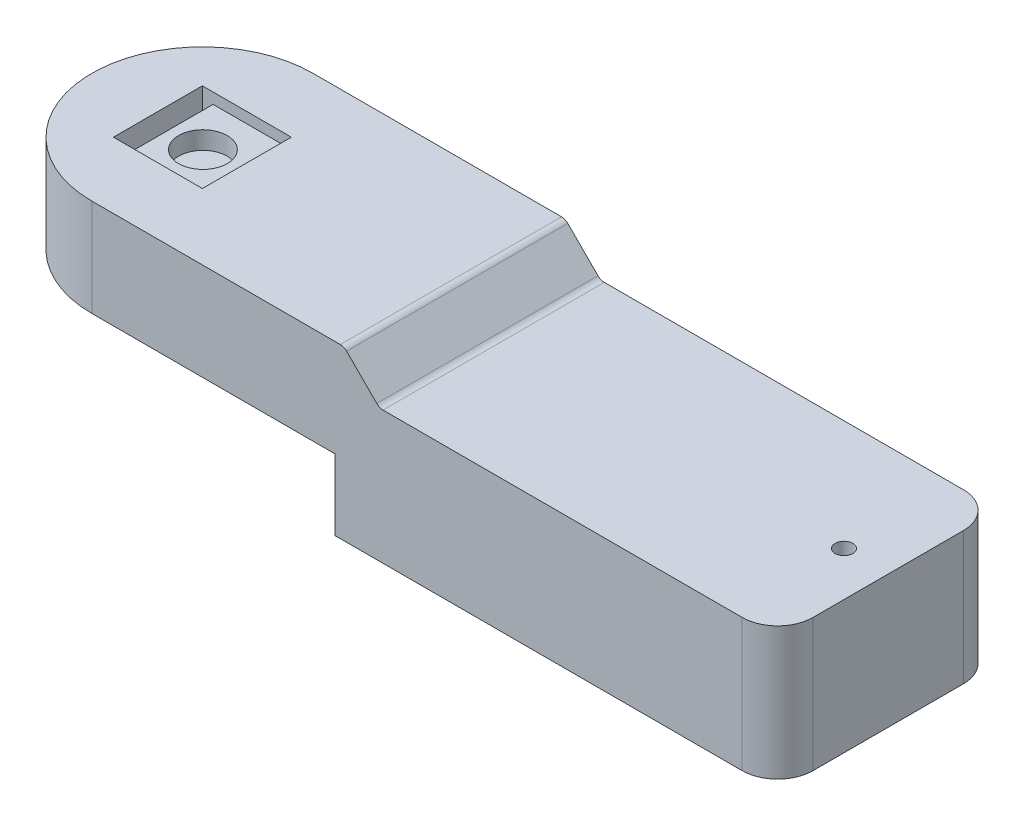
ISO-10303-21;
HEADER;
FILE_DESCRIPTION(('STEP AP214'),'2;1');
FILE_NAME('part.step','',(''),(''),'','','');
FILE_SCHEMA(('AUTOMOTIVE_DESIGN { 1 0 10303 214 1 1 1 1 }'));
ENDSEC;
DATA;
#1=APPLICATION_CONTEXT('core data for automotive mechanical design processes');
#2=APPLICATION_PROTOCOL_DEFINITION('international standard','automotive_design',2000,#1);
#3=PRODUCT_CONTEXT('',#1,'mechanical');
#4=PRODUCT('Part','Part','',(#3));
#5=PRODUCT_RELATED_PRODUCT_CATEGORY('part','',(#4));
#6=PRODUCT_DEFINITION_FORMATION('','',#4);
#7=PRODUCT_DEFINITION_CONTEXT('part definition',#1,'design');
#8=PRODUCT_DEFINITION('design','',#6,#7);
#9=PRODUCT_DEFINITION_SHAPE('','',#8);
#10=(LENGTH_UNIT() NAMED_UNIT(*) SI_UNIT(.MILLI.,.METRE.));
#11=(NAMED_UNIT(*) PLANE_ANGLE_UNIT() SI_UNIT($,.RADIAN.));
#12=(NAMED_UNIT(*) SI_UNIT($,.STERADIAN.) SOLID_ANGLE_UNIT());
#13=UNCERTAINTY_MEASURE_WITH_UNIT(LENGTH_MEASURE(1.E-05),#10,'distance_accuracy_value','');
#14=(GEOMETRIC_REPRESENTATION_CONTEXT(3) GLOBAL_UNCERTAINTY_ASSIGNED_CONTEXT((#13)) GLOBAL_UNIT_ASSIGNED_CONTEXT((#10,
#11,#12)) REPRESENTATION_CONTEXT('',''));
#15=CARTESIAN_POINT('',(0.,0.,0.));
#16=DIRECTION('',(0.,0.,1.));
#17=DIRECTION('',(1.,0.,0.));
#18=AXIS2_PLACEMENT_3D('',#15,#16,#17);
#19=CARTESIAN_POINT('',(-17.5,11.,0.));
#20=DIRECTION('',(0.,-1.,0.));
#21=DIRECTION('',(0.,0.,-1.));
#22=AXIS2_PLACEMENT_3D('',#19,#20,#21);
#23=CYLINDRICAL_SURFACE('',#22,12.5);
#24=DIRECTION('',(0.,-1.,0.));
#25=VECTOR('',#24,1.);
#26=CARTESIAN_POINT('',(-17.5,11.,12.5));
#27=LINE('',#26,#25);
#28=CARTESIAN_POINT('',(-17.5,11.,12.5));
#29=VERTEX_POINT('',#28);
#30=CARTESIAN_POINT('',(-17.5,0.,12.5));
#31=VERTEX_POINT('',#30);
#32=EDGE_CURVE('E298',#29,#31,#27,.T.);
#33=ORIENTED_EDGE('',*,*,#32,.F.);
#34=CARTESIAN_POINT('',(-17.5,11.,0.));
#35=DIRECTION('',(0.,1.,0.));
#36=DIRECTION('',(0.,0.,1.));
#37=AXIS2_PLACEMENT_3D('',#34,#35,#36);
#38=CIRCLE('',#37,12.5);
#39=CARTESIAN_POINT('',(-17.5,11.,-12.5));
#40=VERTEX_POINT('',#39);
#41=EDGE_CURVE('E304',#40,#29,#38,.T.);
#42=ORIENTED_EDGE('',*,*,#41,.F.);
#43=DIRECTION('',(0.,-1.,0.));
#44=VECTOR('',#43,1.);
#45=CARTESIAN_POINT('',(-17.5,11.,-12.5));
#46=LINE('',#45,#44);
#47=CARTESIAN_POINT('',(-17.5,0.,-12.5));
#48=VERTEX_POINT('',#47);
#49=EDGE_CURVE('E301',#48,#40,#46,.F.);
#50=ORIENTED_EDGE('',*,*,#49,.F.);
#51=CARTESIAN_POINT('',(-17.5,0.,0.));
#52=DIRECTION('',(0.,1.,0.));
#53=DIRECTION('',(0.,0.,1.));
#54=AXIS2_PLACEMENT_3D('',#51,#52,#53);
#55=CIRCLE('',#54,12.5);
#56=EDGE_CURVE('E306',#31,#48,#55,.F.);
#57=ORIENTED_EDGE('',*,*,#56,.F.);
#58=EDGE_LOOP('',(#33,#42,#50,#57));
#59=FACE_BOUND('',#58,.T.);
#60=ADVANCED_FACE('F39',(#59),#23,.T.);
#61=CARTESIAN_POINT('',(60.,11.,-12.5));
#62=DIRECTION('',(-1.,0.,0.));
#63=DIRECTION('',(0.,0.,1.));
#64=AXIS2_PLACEMENT_3D('',#61,#62,#63);
#65=PLANE('',#64);
#66=DIRECTION('',(0.,0.,1.));
#67=VECTOR('',#66,1.);
#68=CARTESIAN_POINT('',(60.,-8.,12.5));
#69=LINE('',#68,#67);
#70=CARTESIAN_POINT('',(60.,-8.,-8.5));
#71=VERTEX_POINT('',#70);
#72=CARTESIAN_POINT('',(60.,-8.,8.5));
#73=VERTEX_POINT('',#72);
#74=EDGE_CURVE('E269',#71,#73,#69,.T.);
#75=ORIENTED_EDGE('',*,*,#74,.F.);
#76=DIRECTION('',(0.,-1.,0.));
#77=VECTOR('',#76,1.);
#78=CARTESIAN_POINT('',(60.,11.,-8.5));
#79=LINE('',#78,#77);
#80=CARTESIAN_POINT('',(60.,7.,-8.5));
#81=VERTEX_POINT('',#80);
#82=EDGE_CURVE('E60',#71,#81,#79,.F.);
#83=ORIENTED_EDGE('',*,*,#82,.T.);
#84=DIRECTION('',(0.,0.,-1.));
#85=VECTOR('',#84,1.);
#86=CARTESIAN_POINT('',(60.,7.,12.5));
#87=LINE('',#86,#85);
#88=CARTESIAN_POINT('',(60.,7.,8.5));
#89=VERTEX_POINT('',#88);
#90=EDGE_CURVE('E258',#89,#81,#87,.T.);
#91=ORIENTED_EDGE('',*,*,#90,.F.);
#92=DIRECTION('',(0.,-1.,0.));
#93=VECTOR('',#92,1.);
#94=CARTESIAN_POINT('',(60.,11.,8.5));
#95=LINE('',#94,#93);
#96=EDGE_CURVE('E334',#89,#73,#95,.T.);
#97=ORIENTED_EDGE('',*,*,#96,.T.);
#98=EDGE_LOOP('',(#75,#83,#91,#97));
#99=FACE_BOUND('',#98,.T.);
#100=ADVANCED_FACE('F352',(#99),#65,.F.);
#101=CARTESIAN_POINT('',(0.,0.,0.));
#102=DIRECTION('',(0.,1.,0.));
#103=DIRECTION('',(0.,0.,1.));
#104=AXIS2_PLACEMENT_3D('',#101,#102,#103);
#105=PLANE('',#104);
#106=CARTESIAN_POINT('',(-17.5,0.,0.));
#107=DIRECTION('',(0.,-1.,0.));
#108=DIRECTION('',(0.,0.,-1.));
#109=AXIS2_PLACEMENT_3D('',#106,#107,#108);
#110=CIRCLE('',#109,6.96);
#111=CARTESIAN_POINT('',(-17.5,0.,-6.96));
#112=VERTEX_POINT('',#111);
#113=EDGE_CURVE('E495',#112,#112,#110,.T.);
#114=ORIENTED_EDGE('',*,*,#113,.F.);
#115=EDGE_LOOP('',(#114));
#116=FACE_BOUND('',#115,.T.);
#117=DIRECTION('',(1.,0.,0.));
#118=VECTOR('',#117,1.);
#119=CARTESIAN_POINT('',(-30.,0.,12.5));
#120=LINE('',#119,#118);
#121=CARTESIAN_POINT('',(9.99999999999998,0.,12.5));
#122=VERTEX_POINT('',#121);
#123=EDGE_CURVE('E282',#31,#122,#120,.T.);
#124=ORIENTED_EDGE('',*,*,#123,.F.);
#125=ORIENTED_EDGE('',*,*,#56,.T.);
#126=DIRECTION('',(-1.,0.,0.));
#127=VECTOR('',#126,1.);
#128=CARTESIAN_POINT('',(-30.,0.,-12.5));
#129=LINE('',#128,#127);
#130=CARTESIAN_POINT('',(9.99999999999999,0.,-12.5));
#131=VERTEX_POINT('',#130);
#132=EDGE_CURVE('E287',#131,#48,#129,.T.);
#133=ORIENTED_EDGE('',*,*,#132,.F.);
#134=DIRECTION('',(0.,0.,-1.));
#135=VECTOR('',#134,1.);
#136=CARTESIAN_POINT('',(9.99999999999999,0.,-12.5));
#137=LINE('',#136,#135);
#138=EDGE_CURVE('E262',#122,#131,#137,.T.);
#139=ORIENTED_EDGE('',*,*,#138,.F.);
#140=EDGE_LOOP('',(#124,#125,#133,#139));
#141=FACE_BOUND('',#140,.T.);
#142=ADVANCED_FACE('F367',(#116,#141),#105,.F.);
#143=CARTESIAN_POINT('',(-30.,11.,12.5));
#144=DIRECTION('',(0.,0.,-1.));
#145=DIRECTION('',(-1.,0.,0.));
#146=AXIS2_PLACEMENT_3D('',#143,#144,#145);
#147=PLANE('',#146);
#148=DIRECTION('',(-1.,0.,0.));
#149=VECTOR('',#148,1.);
#150=CARTESIAN_POINT('',(9.99999999999999,-8.,12.5));
#151=LINE('',#150,#149);
#152=CARTESIAN_POINT('',(56.,-8.,12.5));
#153=VERTEX_POINT('',#152);
#154=CARTESIAN_POINT('',(9.99999999999999,-8.,12.5));
#155=VERTEX_POINT('',#154);
#156=EDGE_CURVE('E272',#153,#155,#151,.T.);
#157=ORIENTED_EDGE('',*,*,#156,.F.);
#158=DIRECTION('',(0.,-1.,0.));
#159=VECTOR('',#158,1.);
#160=CARTESIAN_POINT('',(56.,11.,12.5));
#161=LINE('',#160,#159);
#162=CARTESIAN_POINT('',(56.,7.,12.5));
#163=VERTEX_POINT('',#162);
#164=EDGE_CURVE('E11',#153,#163,#161,.F.);
#165=ORIENTED_EDGE('',*,*,#164,.T.);
#166=DIRECTION('',(1.,0.,0.));
#167=VECTOR('',#166,1.);
#168=CARTESIAN_POINT('',(15.,7.,12.5));
#169=LINE('',#168,#167);
#170=CARTESIAN_POINT('',(15.4142135623731,7.,12.5));
#171=VERTEX_POINT('',#170);
#172=EDGE_CURVE('E250',#171,#163,#169,.T.);
#173=ORIENTED_EDGE('',*,*,#172,.F.);
#174=CARTESIAN_POINT('',(15.4142135623731,8.,12.5));
#175=DIRECTION('',(0.,0.,-1.));
#176=DIRECTION('',(-1.,0.,0.));
#177=AXIS2_PLACEMENT_3D('',#174,#175,#176);
#178=CIRCLE('',#177,1.);
#179=CARTESIAN_POINT('',(14.7071067811865,7.29289321881345,12.5));
#180=VERTEX_POINT('',#179);
#181=EDGE_CURVE('E322',#171,#180,#178,.T.);
#182=ORIENTED_EDGE('',*,*,#181,.T.);
#183=DIRECTION('',(-0.707106781186548,0.707106781186547,0.));
#184=VECTOR('',#183,1.);
#185=CARTESIAN_POINT('',(15.,6.99999999999998,12.5));
#186=LINE('',#185,#184);
#187=CARTESIAN_POINT('',(11.2928932188134,10.7071067811865,12.5));
#188=VERTEX_POINT('',#187);
#189=EDGE_CURVE('E289',#180,#188,#186,.T.);
#190=ORIENTED_EDGE('',*,*,#189,.T.);
#191=CARTESIAN_POINT('',(10.5857864376269,10.,12.5));
#192=DIRECTION('',(0.,0.,-1.));
#193=DIRECTION('',(-1.,0.,0.));
#194=AXIS2_PLACEMENT_3D('',#191,#192,#193);
#195=CIRCLE('',#194,1.);
#196=CARTESIAN_POINT('',(10.5857864376269,11.,12.5));
#197=VERTEX_POINT('',#196);
#198=EDGE_CURVE('E320',#188,#197,#195,.F.);
#199=ORIENTED_EDGE('',*,*,#198,.T.);
#200=DIRECTION('',(1.,0.,0.));
#201=VECTOR('',#200,1.);
#202=CARTESIAN_POINT('',(-30.,11.,12.5));
#203=LINE('',#202,#201);
#204=EDGE_CURVE('E283',#29,#197,#203,.T.);
#205=ORIENTED_EDGE('',*,*,#204,.F.);
#206=ORIENTED_EDGE('',*,*,#32,.T.);
#207=ORIENTED_EDGE('',*,*,#123,.T.);
#208=DIRECTION('',(0.,1.,0.));
#209=VECTOR('',#208,1.);
#210=CARTESIAN_POINT('',(9.99999999999999,-8.,12.5));
#211=LINE('',#210,#209);
#212=EDGE_CURVE('E274',#155,#122,#211,.T.);
#213=ORIENTED_EDGE('',*,*,#212,.F.);
#214=EDGE_LOOP('',(#157,#165,#173,#182,#190,#199,#205,#206,#207,#213));
#215=FACE_BOUND('',#214,.T.);
#216=ADVANCED_FACE('F357',(#215),#147,.F.);
#217=CARTESIAN_POINT('',(-30.,11.,-12.5));
#218=DIRECTION('',(0.,0.,1.));
#219=DIRECTION('',(1.,0.,0.));
#220=AXIS2_PLACEMENT_3D('',#217,#218,#219);
#221=PLANE('',#220);
#222=DIRECTION('',(-1.,0.,0.));
#223=VECTOR('',#222,1.);
#224=CARTESIAN_POINT('',(60.,7.,-12.5));
#225=LINE('',#224,#223);
#226=CARTESIAN_POINT('',(56.,7.,-12.5));
#227=VERTEX_POINT('',#226);
#228=CARTESIAN_POINT('',(15.4142135623731,7.,-12.5));
#229=VERTEX_POINT('',#228);
#230=EDGE_CURVE('E260',#227,#229,#225,.T.);
#231=ORIENTED_EDGE('',*,*,#230,.F.);
#232=DIRECTION('',(0.,-1.,0.));
#233=VECTOR('',#232,1.);
#234=CARTESIAN_POINT('',(56.,11.,-12.5));
#235=LINE('',#234,#233);
#236=CARTESIAN_POINT('',(56.,-8.,-12.5));
#237=VERTEX_POINT('',#236);
#238=EDGE_CURVE('E327',#227,#237,#235,.T.);
#239=ORIENTED_EDGE('',*,*,#238,.T.);
#240=DIRECTION('',(1.,0.,0.));
#241=VECTOR('',#240,1.);
#242=CARTESIAN_POINT('',(60.,-8.,-12.5));
#243=LINE('',#242,#241);
#244=CARTESIAN_POINT('',(9.99999999999999,-8.,-12.5));
#245=VERTEX_POINT('',#244);
#246=EDGE_CURVE('E266',#245,#237,#243,.T.);
#247=ORIENTED_EDGE('',*,*,#246,.F.);
#248=DIRECTION('',(0.,1.,0.));
#249=VECTOR('',#248,1.);
#250=CARTESIAN_POINT('',(9.99999999999999,-8.,-12.5));
#251=LINE('',#250,#249);
#252=EDGE_CURVE('E279',#245,#131,#251,.T.);
#253=ORIENTED_EDGE('',*,*,#252,.T.);
#254=ORIENTED_EDGE('',*,*,#132,.T.);
#255=ORIENTED_EDGE('',*,*,#49,.T.);
#256=DIRECTION('',(-1.,0.,0.));
#257=VECTOR('',#256,1.);
#258=CARTESIAN_POINT('',(-30.,11.,-12.5));
#259=LINE('',#258,#257);
#260=CARTESIAN_POINT('',(10.5857864376269,11.,-12.5));
#261=VERTEX_POINT('',#260);
#262=EDGE_CURVE('E286',#261,#40,#259,.T.);
#263=ORIENTED_EDGE('',*,*,#262,.F.);
#264=CARTESIAN_POINT('',(10.5857864376269,10.,-12.5));
#265=DIRECTION('',(0.,0.,1.));
#266=DIRECTION('',(1.,0.,0.));
#267=AXIS2_PLACEMENT_3D('',#264,#265,#266);
#268=CIRCLE('',#267,1.);
#269=CARTESIAN_POINT('',(11.2928932188134,10.7071067811865,-12.5));
#270=VERTEX_POINT('',#269);
#271=EDGE_CURVE('E318',#261,#270,#268,.F.);
#272=ORIENTED_EDGE('',*,*,#271,.T.);
#273=DIRECTION('',(0.707106781186548,-0.707106781186547,0.));
#274=VECTOR('',#273,1.);
#275=CARTESIAN_POINT('',(15.,6.99999999999998,-12.5));
#276=LINE('',#275,#274);
#277=CARTESIAN_POINT('',(14.7071067811865,7.29289321881345,-12.5));
#278=VERTEX_POINT('',#277);
#279=EDGE_CURVE('E295',#270,#278,#276,.T.);
#280=ORIENTED_EDGE('',*,*,#279,.T.);
#281=CARTESIAN_POINT('',(15.4142135623731,8.,-12.5));
#282=DIRECTION('',(0.,0.,1.));
#283=DIRECTION('',(1.,0.,0.));
#284=AXIS2_PLACEMENT_3D('',#281,#282,#283);
#285=CIRCLE('',#284,1.);
#286=EDGE_CURVE('E324',#278,#229,#285,.T.);
#287=ORIENTED_EDGE('',*,*,#286,.T.);
#288=EDGE_LOOP('',(#231,#239,#247,#253,#254,#255,#263,#272,#280,#287));
#289=FACE_BOUND('',#288,.T.);
#290=ADVANCED_FACE('F346',(#289),#221,.F.);
#291=CARTESIAN_POINT('',(0.,11.,0.));
#292=DIRECTION('',(0.,1.,0.));
#293=DIRECTION('',(0.,0.,1.));
#294=AXIS2_PLACEMENT_3D('',#291,#292,#293);
#295=PLANE('',#294);
#296=DIRECTION('',(0.,0.,1.));
#297=VECTOR('',#296,1.);
#298=CARTESIAN_POINT('',(-22.525,11.,-5.025));
#299=LINE('',#298,#297);
#300=CARTESIAN_POINT('',(-22.525,11.,-5.025));
#301=VERTEX_POINT('',#300);
#302=CARTESIAN_POINT('',(-22.525,11.,5.025));
#303=VERTEX_POINT('',#302);
#304=EDGE_CURVE('E213',#301,#303,#299,.T.);
#305=ORIENTED_EDGE('',*,*,#304,.F.);
#306=DIRECTION('',(-1.,0.,0.));
#307=VECTOR('',#306,1.);
#308=CARTESIAN_POINT('',(-22.525,11.,-5.025));
#309=LINE('',#308,#307);
#310=CARTESIAN_POINT('',(-12.475,11.,-5.025));
#311=VERTEX_POINT('',#310);
#312=EDGE_CURVE('E237',#311,#301,#309,.T.);
#313=ORIENTED_EDGE('',*,*,#312,.F.);
#314=DIRECTION('',(0.,0.,-1.));
#315=VECTOR('',#314,1.);
#316=CARTESIAN_POINT('',(-12.475,11.,-5.025));
#317=LINE('',#316,#315);
#318=CARTESIAN_POINT('',(-12.475,11.,5.025));
#319=VERTEX_POINT('',#318);
#320=EDGE_CURVE('E244',#319,#311,#317,.T.);
#321=ORIENTED_EDGE('',*,*,#320,.F.);
#322=DIRECTION('',(1.,0.,0.));
#323=VECTOR('',#322,1.);
#324=CARTESIAN_POINT('',(-22.525,11.,5.025));
#325=LINE('',#324,#323);
#326=EDGE_CURVE('E241',#303,#319,#325,.T.);
#327=ORIENTED_EDGE('',*,*,#326,.F.);
#328=EDGE_LOOP('',(#305,#313,#321,#327));
#329=FACE_BOUND('',#328,.T.);
#330=ORIENTED_EDGE('',*,*,#204,.T.);
#331=DIRECTION('',(0.,0.,-1.));
#332=VECTOR('',#331,1.);
#333=CARTESIAN_POINT('',(10.5857864376269,11.,0.));
#334=LINE('',#333,#332);
#335=EDGE_CURVE('E315',#197,#261,#334,.T.);
#336=ORIENTED_EDGE('',*,*,#335,.T.);
#337=ORIENTED_EDGE('',*,*,#262,.T.);
#338=ORIENTED_EDGE('',*,*,#41,.T.);
#339=EDGE_LOOP('',(#330,#336,#337,#338));
#340=FACE_BOUND('',#339,.T.);
#341=ADVANCED_FACE('F373',(#329,#340),#295,.T.);
#342=CARTESIAN_POINT('',(9.99999999999999,-8.,-12.5));
#343=DIRECTION('',(1.,0.,0.));
#344=DIRECTION('',(0.,0.,-1.));
#345=AXIS2_PLACEMENT_3D('',#342,#343,#344);
#346=PLANE('',#345);
#347=ORIENTED_EDGE('',*,*,#138,.T.);
#348=ORIENTED_EDGE('',*,*,#252,.F.);
#349=DIRECTION('',(0.,0.,-1.));
#350=VECTOR('',#349,1.);
#351=CARTESIAN_POINT('',(9.99999999999999,-8.,-12.5));
#352=LINE('',#351,#350);
#353=EDGE_CURVE('E263',#155,#245,#352,.T.);
#354=ORIENTED_EDGE('',*,*,#353,.F.);
#355=ORIENTED_EDGE('',*,*,#212,.T.);
#356=EDGE_LOOP('',(#347,#348,#354,#355));
#357=FACE_BOUND('',#356,.T.);
#358=ADVANCED_FACE('F363',(#357),#346,.F.);
#359=CARTESIAN_POINT('',(0.,-8.,0.));
#360=DIRECTION('',(0.,1.,0.));
#361=DIRECTION('',(0.,0.,1.));
#362=AXIS2_PLACEMENT_3D('',#359,#360,#361);
#363=PLANE('',#362);
#364=CARTESIAN_POINT('',(55.,-8.,0.));
#365=DIRECTION('',(0.,1.,0.));
#366=DIRECTION('',(0.,0.,1.));
#367=AXIS2_PLACEMENT_3D('',#364,#365,#366);
#368=CIRCLE('',#367,0.999999999999998);
#369=CARTESIAN_POINT('',(55.,-8.,0.999999999999998));
#370=VERTEX_POINT('',#369);
#371=EDGE_CURVE('E484',#370,#370,#368,.T.);
#372=ORIENTED_EDGE('',*,*,#371,.T.);
#373=EDGE_LOOP('',(#372));
#374=FACE_BOUND('',#373,.T.);
#375=ORIENTED_EDGE('',*,*,#246,.T.);
#376=CARTESIAN_POINT('',(56.,-8.,-8.5));
#377=DIRECTION('',(0.,1.,0.));
#378=DIRECTION('',(0.,0.,1.));
#379=AXIS2_PLACEMENT_3D('',#376,#377,#378);
#380=CIRCLE('',#379,4.);
#381=EDGE_CURVE('E332',#237,#71,#380,.F.);
#382=ORIENTED_EDGE('',*,*,#381,.T.);
#383=ORIENTED_EDGE('',*,*,#74,.T.);
#384=CARTESIAN_POINT('',(56.,-8.,8.5));
#385=DIRECTION('',(0.,1.,0.));
#386=DIRECTION('',(0.,0.,1.));
#387=AXIS2_PLACEMENT_3D('',#384,#385,#386);
#388=CIRCLE('',#387,4.);
#389=EDGE_CURVE('E330',#73,#153,#388,.F.);
#390=ORIENTED_EDGE('',*,*,#389,.T.);
#391=ORIENTED_EDGE('',*,*,#156,.T.);
#392=ORIENTED_EDGE('',*,*,#353,.T.);
#393=EDGE_LOOP('',(#375,#382,#383,#390,#391,#392));
#394=FACE_BOUND('',#393,.T.);
#395=ADVANCED_FACE('F351',(#374,#394),#363,.F.);
#396=CARTESIAN_POINT('',(0.,7.,0.));
#397=DIRECTION('',(0.,1.,0.));
#398=DIRECTION('',(0.,0.,1.));
#399=AXIS2_PLACEMENT_3D('',#396,#397,#398);
#400=PLANE('',#399);
#401=CARTESIAN_POINT('',(55.,7.,0.));
#402=DIRECTION('',(0.,1.,0.));
#403=DIRECTION('',(0.,0.,1.));
#404=AXIS2_PLACEMENT_3D('',#401,#402,#403);
#405=CIRCLE('',#404,0.999999999999998);
#406=CARTESIAN_POINT('',(55.,7.,0.999999999999998));
#407=VERTEX_POINT('',#406);
#408=EDGE_CURVE('E487',#407,#407,#405,.T.);
#409=ORIENTED_EDGE('',*,*,#408,.F.);
#410=EDGE_LOOP('',(#409));
#411=FACE_BOUND('',#410,.T.);
#412=ORIENTED_EDGE('',*,*,#90,.T.);
#413=CARTESIAN_POINT('',(56.,7.,-8.5));
#414=DIRECTION('',(0.,1.,0.));
#415=DIRECTION('',(0.,0.,1.));
#416=AXIS2_PLACEMENT_3D('',#413,#414,#415);
#417=CIRCLE('',#416,4.);
#418=EDGE_CURVE('E47',#81,#227,#417,.T.);
#419=ORIENTED_EDGE('',*,*,#418,.T.);
#420=ORIENTED_EDGE('',*,*,#230,.T.);
#421=DIRECTION('',(0.,0.,1.));
#422=VECTOR('',#421,1.);
#423=CARTESIAN_POINT('',(15.4142135623731,7.,12.5));
#424=LINE('',#423,#422);
#425=EDGE_CURVE('E308',#229,#171,#424,.T.);
#426=ORIENTED_EDGE('',*,*,#425,.T.);
#427=ORIENTED_EDGE('',*,*,#172,.T.);
#428=CARTESIAN_POINT('',(56.,7.,8.5));
#429=DIRECTION('',(0.,1.,0.));
#430=DIRECTION('',(0.,0.,1.));
#431=AXIS2_PLACEMENT_3D('',#428,#429,#430);
#432=CIRCLE('',#431,4.);
#433=EDGE_CURVE('E338',#163,#89,#432,.T.);
#434=ORIENTED_EDGE('',*,*,#433,.T.);
#435=EDGE_LOOP('',(#412,#419,#420,#426,#427,#434));
#436=FACE_BOUND('',#435,.T.);
#437=ADVANCED_FACE('F342',(#411,#436),#400,.T.);
#438=CARTESIAN_POINT('',(-22.525,9.79,-5.025));
#439=DIRECTION('',(-1.,0.,0.));
#440=DIRECTION('',(0.,0.,1.));
#441=AXIS2_PLACEMENT_3D('',#438,#439,#440);
#442=PLANE('',#441);
#443=ORIENTED_EDGE('',*,*,#304,.T.);
#444=DIRECTION('',(0.,1.,0.));
#445=VECTOR('',#444,1.);
#446=CARTESIAN_POINT('',(-22.525,9.79,5.025));
#447=LINE('',#446,#445);
#448=CARTESIAN_POINT('',(-22.525,7.77,5.025));
#449=VERTEX_POINT('',#448);
#450=EDGE_CURVE('E239',#449,#303,#447,.T.);
#451=ORIENTED_EDGE('',*,*,#450,.F.);
#452=DIRECTION('',(0.,0.,1.));
#453=VECTOR('',#452,1.);
#454=CARTESIAN_POINT('',(-22.525,7.77,5.025));
#455=LINE('',#454,#453);
#456=CARTESIAN_POINT('',(-22.525,7.77,-5.025));
#457=VERTEX_POINT('',#456);
#458=EDGE_CURVE('E215',#457,#449,#455,.T.);
#459=ORIENTED_EDGE('',*,*,#458,.F.);
#460=DIRECTION('',(0.,1.,0.));
#461=VECTOR('',#460,1.);
#462=CARTESIAN_POINT('',(-22.525,9.79,-5.025));
#463=LINE('',#462,#461);
#464=EDGE_CURVE('E248',#457,#301,#463,.T.);
#465=ORIENTED_EDGE('',*,*,#464,.T.);
#466=EDGE_LOOP('',(#443,#451,#459,#465));
#467=FACE_BOUND('',#466,.T.);
#468=ADVANCED_FACE('F422',(#467),#442,.F.);
#469=CARTESIAN_POINT('',(-22.525,9.79,-5.025));
#470=DIRECTION('',(0.,0.,-1.));
#471=DIRECTION('',(-1.,0.,0.));
#472=AXIS2_PLACEMENT_3D('',#469,#470,#471);
#473=PLANE('',#472);
#474=ORIENTED_EDGE('',*,*,#312,.T.);
#475=ORIENTED_EDGE('',*,*,#464,.F.);
#476=DIRECTION('',(-1.,0.,0.));
#477=VECTOR('',#476,1.);
#478=CARTESIAN_POINT('',(-22.525,7.77,-5.025));
#479=LINE('',#478,#477);
#480=CARTESIAN_POINT('',(-21.315,7.77,-5.025));
#481=VERTEX_POINT('',#480);
#482=EDGE_CURVE('E225',#481,#457,#479,.T.);
#483=ORIENTED_EDGE('',*,*,#482,.F.);
#484=DIRECTION('',(0.,1.,0.));
#485=VECTOR('',#484,1.);
#486=CARTESIAN_POINT('',(-21.315,7.77,-5.025));
#487=LINE('',#486,#485);
#488=CARTESIAN_POINT('',(-21.315,9.79,-5.025));
#489=VERTEX_POINT('',#488);
#490=EDGE_CURVE('E205',#481,#489,#487,.T.);
#491=ORIENTED_EDGE('',*,*,#490,.T.);
#492=DIRECTION('',(-1.,0.,0.));
#493=VECTOR('',#492,1.);
#494=CARTESIAN_POINT('',(-22.525,9.79,-5.025));
#495=LINE('',#494,#493);
#496=CARTESIAN_POINT('',(-13.685,9.79,-5.025));
#497=VERTEX_POINT('',#496);
#498=EDGE_CURVE('E186',#497,#489,#495,.T.);
#499=ORIENTED_EDGE('',*,*,#498,.F.);
#500=DIRECTION('',(0.,1.,0.));
#501=VECTOR('',#500,1.);
#502=CARTESIAN_POINT('',(-13.685,7.77,-5.025));
#503=LINE('',#502,#501);
#504=CARTESIAN_POINT('',(-13.685,7.77,-5.025));
#505=VERTEX_POINT('',#504);
#506=EDGE_CURVE('E178',#505,#497,#503,.T.);
#507=ORIENTED_EDGE('',*,*,#506,.F.);
#508=DIRECTION('',(-1.,0.,0.));
#509=VECTOR('',#508,1.);
#510=CARTESIAN_POINT('',(-12.475,7.77,-5.025));
#511=LINE('',#510,#509);
#512=CARTESIAN_POINT('',(-12.475,7.77,-5.025));
#513=VERTEX_POINT('',#512);
#514=EDGE_CURVE('E183',#513,#505,#511,.T.);
#515=ORIENTED_EDGE('',*,*,#514,.F.);
#516=DIRECTION('',(0.,1.,0.));
#517=VECTOR('',#516,1.);
#518=CARTESIAN_POINT('',(-12.475,9.79,-5.025));
#519=LINE('',#518,#517);
#520=EDGE_CURVE('E251',#513,#311,#519,.T.);
#521=ORIENTED_EDGE('',*,*,#520,.T.);
#522=EDGE_LOOP('',(#474,#475,#483,#491,#499,#507,#515,#521));
#523=FACE_BOUND('',#522,.T.);
#524=ADVANCED_FACE('F181',(#523),#473,.F.);
#525=CARTESIAN_POINT('',(-12.475,9.79,-5.025));
#526=DIRECTION('',(1.,0.,0.));
#527=DIRECTION('',(0.,0.,-1.));
#528=AXIS2_PLACEMENT_3D('',#525,#526,#527);
#529=PLANE('',#528);
#530=ORIENTED_EDGE('',*,*,#320,.T.);
#531=ORIENTED_EDGE('',*,*,#520,.F.);
#532=DIRECTION('',(0.,0.,-1.));
#533=VECTOR('',#532,1.);
#534=CARTESIAN_POINT('',(-12.475,7.77,5.025));
#535=LINE('',#534,#533);
#536=CARTESIAN_POINT('',(-12.475,7.77,5.025));
#537=VERTEX_POINT('',#536);
#538=EDGE_CURVE('E191',#537,#513,#535,.T.);
#539=ORIENTED_EDGE('',*,*,#538,.F.);
#540=DIRECTION('',(0.,1.,0.));
#541=VECTOR('',#540,1.);
#542=CARTESIAN_POINT('',(-12.475,9.79,5.025));
#543=LINE('',#542,#541);
#544=EDGE_CURVE('E253',#537,#319,#543,.T.);
#545=ORIENTED_EDGE('',*,*,#544,.T.);
#546=EDGE_LOOP('',(#530,#531,#539,#545));
#547=FACE_BOUND('',#546,.T.);
#548=ADVANCED_FACE('F431',(#547),#529,.F.);
#549=CARTESIAN_POINT('',(-22.525,9.79,5.025));
#550=DIRECTION('',(0.,0.,1.));
#551=DIRECTION('',(1.,0.,0.));
#552=AXIS2_PLACEMENT_3D('',#549,#550,#551);
#553=PLANE('',#552);
#554=ORIENTED_EDGE('',*,*,#326,.T.);
#555=ORIENTED_EDGE('',*,*,#544,.F.);
#556=DIRECTION('',(1.,0.,0.));
#557=VECTOR('',#556,1.);
#558=CARTESIAN_POINT('',(-13.685,7.77,5.025));
#559=LINE('',#558,#557);
#560=CARTESIAN_POINT('',(-13.685,7.77,5.025));
#561=VERTEX_POINT('',#560);
#562=EDGE_CURVE('E199',#561,#537,#559,.T.);
#563=ORIENTED_EDGE('',*,*,#562,.F.);
#564=DIRECTION('',(0.,1.,0.));
#565=VECTOR('',#564,1.);
#566=CARTESIAN_POINT('',(-13.685,7.77,5.025));
#567=LINE('',#566,#565);
#568=CARTESIAN_POINT('',(-13.685,9.79,5.025));
#569=VERTEX_POINT('',#568);
#570=EDGE_CURVE('E190',#561,#569,#567,.T.);
#571=ORIENTED_EDGE('',*,*,#570,.T.);
#572=DIRECTION('',(1.,0.,0.));
#573=VECTOR('',#572,1.);
#574=CARTESIAN_POINT('',(-22.525,9.79,5.025));
#575=LINE('',#574,#573);
#576=CARTESIAN_POINT('',(-21.315,9.79,5.025));
#577=VERTEX_POINT('',#576);
#578=EDGE_CURVE('E234',#577,#569,#575,.T.);
#579=ORIENTED_EDGE('',*,*,#578,.F.);
#580=DIRECTION('',(0.,1.,0.));
#581=VECTOR('',#580,1.);
#582=CARTESIAN_POINT('',(-21.315,7.77,5.025));
#583=LINE('',#582,#581);
#584=CARTESIAN_POINT('',(-21.315,7.77,5.025));
#585=VERTEX_POINT('',#584);
#586=EDGE_CURVE('E228',#585,#577,#583,.T.);
#587=ORIENTED_EDGE('',*,*,#586,.F.);
#588=DIRECTION('',(1.,0.,0.));
#589=VECTOR('',#588,1.);
#590=CARTESIAN_POINT('',(-21.315,7.77,5.025));
#591=LINE('',#590,#589);
#592=EDGE_CURVE('E218',#449,#585,#591,.T.);
#593=ORIENTED_EDGE('',*,*,#592,.F.);
#594=ORIENTED_EDGE('',*,*,#450,.T.);
#595=EDGE_LOOP('',(#554,#555,#563,#571,#579,#587,#593,#594));
#596=FACE_BOUND('',#595,.T.);
#597=ADVANCED_FACE('F427',(#596),#553,.F.);
#598=CARTESIAN_POINT('',(0.,9.79,0.));
#599=DIRECTION('',(0.,1.,0.));
#600=DIRECTION('',(0.,0.,1.));
#601=AXIS2_PLACEMENT_3D('',#598,#599,#600);
#602=PLANE('',#601);
#603=CARTESIAN_POINT('',(-17.465,9.79,-0.0250000000000007));
#604=DIRECTION('',(0.,1.,0.));
#605=DIRECTION('',(0.,0.,1.));
#606=AXIS2_PLACEMENT_3D('',#603,#604,#605);
#607=CIRCLE('',#606,2.75);
#608=CARTESIAN_POINT('',(-17.465,9.79,2.725));
#609=VERTEX_POINT('',#608);
#610=EDGE_CURVE('E208',#609,#609,#607,.T.);
#611=ORIENTED_EDGE('',*,*,#610,.F.);
#612=EDGE_LOOP('',(#611));
#613=FACE_BOUND('',#612,.T.);
#614=DIRECTION('',(0.,0.,1.));
#615=VECTOR('',#614,1.);
#616=CARTESIAN_POINT('',(-13.685,9.79,-5.025));
#617=LINE('',#616,#615);
#618=EDGE_CURVE('E203',#497,#569,#617,.T.);
#619=ORIENTED_EDGE('',*,*,#618,.F.);
#620=ORIENTED_EDGE('',*,*,#498,.T.);
#621=DIRECTION('',(0.,0.,-1.));
#622=VECTOR('',#621,1.);
#623=CARTESIAN_POINT('',(-21.315,9.79,-5.025));
#624=LINE('',#623,#622);
#625=EDGE_CURVE('E219',#577,#489,#624,.T.);
#626=ORIENTED_EDGE('',*,*,#625,.F.);
#627=ORIENTED_EDGE('',*,*,#578,.T.);
#628=EDGE_LOOP('',(#619,#620,#626,#627));
#629=FACE_BOUND('',#628,.T.);
#630=ADVANCED_FACE('F430',(#613,#629),#602,.T.);
#631=CARTESIAN_POINT('',(-21.315,7.77,-5.025));
#632=DIRECTION('',(1.,0.,0.));
#633=DIRECTION('',(0.,0.,-1.));
#634=AXIS2_PLACEMENT_3D('',#631,#632,#633);
#635=PLANE('',#634);
#636=ORIENTED_EDGE('',*,*,#625,.T.);
#637=ORIENTED_EDGE('',*,*,#490,.F.);
#638=DIRECTION('',(0.,0.,-1.));
#639=VECTOR('',#638,1.);
#640=CARTESIAN_POINT('',(-21.315,7.77,-5.025));
#641=LINE('',#640,#639);
#642=EDGE_CURVE('E222',#585,#481,#641,.T.);
#643=ORIENTED_EDGE('',*,*,#642,.F.);
#644=ORIENTED_EDGE('',*,*,#586,.T.);
#645=EDGE_LOOP('',(#636,#637,#643,#644));
#646=FACE_BOUND('',#645,.T.);
#647=ADVANCED_FACE('F440',(#646),#635,.F.);
#648=CARTESIAN_POINT('',(0.,7.77,0.));
#649=DIRECTION('',(0.,-1.,0.));
#650=DIRECTION('',(0.,0.,-1.));
#651=AXIS2_PLACEMENT_3D('',#648,#649,#650);
#652=PLANE('',#651);
#653=ORIENTED_EDGE('',*,*,#458,.T.);
#654=ORIENTED_EDGE('',*,*,#592,.T.);
#655=ORIENTED_EDGE('',*,*,#642,.T.);
#656=ORIENTED_EDGE('',*,*,#482,.T.);
#657=EDGE_LOOP('',(#653,#654,#655,#656));
#658=FACE_BOUND('',#657,.T.);
#659=ADVANCED_FACE('F444',(#658),#652,.F.);
#660=CARTESIAN_POINT('',(-13.685,7.77,-5.025));
#661=DIRECTION('',(-1.,0.,0.));
#662=DIRECTION('',(0.,0.,1.));
#663=AXIS2_PLACEMENT_3D('',#660,#661,#662);
#664=PLANE('',#663);
#665=ORIENTED_EDGE('',*,*,#618,.T.);
#666=ORIENTED_EDGE('',*,*,#570,.F.);
#667=DIRECTION('',(0.,0.,1.));
#668=VECTOR('',#667,1.);
#669=CARTESIAN_POINT('',(-13.685,7.77,-5.025));
#670=LINE('',#669,#668);
#671=EDGE_CURVE('E194',#505,#561,#670,.T.);
#672=ORIENTED_EDGE('',*,*,#671,.F.);
#673=ORIENTED_EDGE('',*,*,#506,.T.);
#674=EDGE_LOOP('',(#665,#666,#672,#673));
#675=FACE_BOUND('',#674,.T.);
#676=ADVANCED_FACE('F195',(#675),#664,.F.);
#677=CARTESIAN_POINT('',(0.,7.77,0.));
#678=DIRECTION('',(0.,1.,0.));
#679=DIRECTION('',(0.,0.,1.));
#680=AXIS2_PLACEMENT_3D('',#677,#678,#679);
#681=PLANE('',#680);
#682=ORIENTED_EDGE('',*,*,#514,.T.);
#683=ORIENTED_EDGE('',*,*,#671,.T.);
#684=ORIENTED_EDGE('',*,*,#562,.T.);
#685=ORIENTED_EDGE('',*,*,#538,.T.);
#686=EDGE_LOOP('',(#682,#683,#684,#685));
#687=FACE_BOUND('',#686,.T.);
#688=ADVANCED_FACE('F201',(#687),#681,.T.);
#689=CARTESIAN_POINT('',(-17.465,7.77,-0.0250000000000007));
#690=DIRECTION('',(0.,1.,0.));
#691=DIRECTION('',(0.,0.,1.));
#692=AXIS2_PLACEMENT_3D('',#689,#690,#691);
#693=CYLINDRICAL_SURFACE('',#692,2.75);
#694=CARTESIAN_POINT('',(-17.465,7.77,-0.0250000000000007));
#695=DIRECTION('',(0.,1.,0.));
#696=DIRECTION('',(0.,0.,1.));
#697=AXIS2_PLACEMENT_3D('',#694,#695,#696);
#698=CIRCLE('',#697,2.75);
#699=CARTESIAN_POINT('',(-17.465,7.77,2.725));
#700=VERTEX_POINT('',#699);
#701=EDGE_CURVE('E231',#700,#700,#698,.T.);
#702=ORIENTED_EDGE('',*,*,#701,.F.);
#703=EDGE_LOOP('',(#702));
#704=FACE_BOUND('',#703,.T.);
#705=ORIENTED_EDGE('',*,*,#610,.T.);
#706=EDGE_LOOP('',(#705));
#707=FACE_BOUND('',#706,.T.);
#708=ADVANCED_FACE('F453',(#704,#707),#693,.F.);
#709=CARTESIAN_POINT('',(-17.465,7.77,-0.0250000000000007));
#710=DIRECTION('',(0.,1.,0.));
#711=DIRECTION('',(0.,0.,1.));
#712=AXIS2_PLACEMENT_3D('',#709,#710,#711);
#713=PLANE('',#712);
#714=ORIENTED_EDGE('',*,*,#701,.T.);
#715=EDGE_LOOP('',(#714));
#716=FACE_BOUND('',#715,.T.);
#717=ADVANCED_FACE('F393',(#716),#713,.T.);
#718=CARTESIAN_POINT('',(15.,6.99999999999998,-12.5));
#719=DIRECTION('',(0.707106781186547,0.707106781186548,0.));
#720=DIRECTION('',(0.,0.,-1.));
#721=AXIS2_PLACEMENT_3D('',#718,#719,#720);
#722=PLANE('',#721);
#723=ORIENTED_EDGE('',*,*,#189,.F.);
#724=DIRECTION('',(0.,0.,1.));
#725=VECTOR('',#724,1.);
#726=CARTESIAN_POINT('',(14.7071067811865,7.29289321881345,-12.5));
#727=LINE('',#726,#725);
#728=EDGE_CURVE('E313',#180,#278,#727,.F.);
#729=ORIENTED_EDGE('',*,*,#728,.T.);
#730=ORIENTED_EDGE('',*,*,#279,.F.);
#731=DIRECTION('',(0.,0.,-1.));
#732=VECTOR('',#731,1.);
#733=CARTESIAN_POINT('',(11.2928932188134,10.7071067811865,-12.5));
#734=LINE('',#733,#732);
#735=EDGE_CURVE('E311',#270,#188,#734,.F.);
#736=ORIENTED_EDGE('',*,*,#735,.T.);
#737=EDGE_LOOP('',(#723,#729,#730,#736));
#738=FACE_BOUND('',#737,.T.);
#739=ADVANCED_FACE('F380',(#738),#722,.T.);
#740=CARTESIAN_POINT('',(15.4142135623731,8.,0.));
#741=DIRECTION('',(0.,0.,-1.));
#742=DIRECTION('',(-1.,0.,0.));
#743=AXIS2_PLACEMENT_3D('',#740,#741,#742);
#744=CYLINDRICAL_SURFACE('',#743,1.);
#745=ORIENTED_EDGE('',*,*,#286,.F.);
#746=ORIENTED_EDGE('',*,*,#728,.F.);
#747=ORIENTED_EDGE('',*,*,#181,.F.);
#748=ORIENTED_EDGE('',*,*,#425,.F.);
#749=EDGE_LOOP('',(#745,#746,#747,#748));
#750=FACE_BOUND('',#749,.T.);
#751=ADVANCED_FACE('F385',(#750),#744,.F.);
#752=CARTESIAN_POINT('',(10.5857864376269,10.,0.));
#753=DIRECTION('',(0.,0.,-1.));
#754=DIRECTION('',(-1.,0.,0.));
#755=AXIS2_PLACEMENT_3D('',#752,#753,#754);
#756=CYLINDRICAL_SURFACE('',#755,1.);
#757=ORIENTED_EDGE('',*,*,#198,.F.);
#758=ORIENTED_EDGE('',*,*,#735,.F.);
#759=ORIENTED_EDGE('',*,*,#271,.F.);
#760=ORIENTED_EDGE('',*,*,#335,.F.);
#761=EDGE_LOOP('',(#757,#758,#759,#760));
#762=FACE_BOUND('',#761,.T.);
#763=ADVANCED_FACE('F383',(#762),#756,.T.);
#764=CARTESIAN_POINT('',(56.,11.,-8.5));
#765=DIRECTION('',(0.,-1.,0.));
#766=DIRECTION('',(0.,0.,-1.));
#767=AXIS2_PLACEMENT_3D('',#764,#765,#766);
#768=CYLINDRICAL_SURFACE('',#767,4.);
#769=ORIENTED_EDGE('',*,*,#418,.F.);
#770=ORIENTED_EDGE('',*,*,#82,.F.);
#771=ORIENTED_EDGE('',*,*,#381,.F.);
#772=ORIENTED_EDGE('',*,*,#238,.F.);
#773=EDGE_LOOP('',(#769,#770,#771,#772));
#774=FACE_BOUND('',#773,.T.);
#775=ADVANCED_FACE('F349',(#774),#768,.T.);
#776=CARTESIAN_POINT('',(56.,11.,8.5));
#777=DIRECTION('',(0.,-1.,0.));
#778=DIRECTION('',(0.,0.,-1.));
#779=AXIS2_PLACEMENT_3D('',#776,#777,#778);
#780=CYLINDRICAL_SURFACE('',#779,4.);
#781=ORIENTED_EDGE('',*,*,#433,.F.);
#782=ORIENTED_EDGE('',*,*,#164,.F.);
#783=ORIENTED_EDGE('',*,*,#389,.F.);
#784=ORIENTED_EDGE('',*,*,#96,.F.);
#785=EDGE_LOOP('',(#781,#782,#783,#784));
#786=FACE_BOUND('',#785,.T.);
#787=ADVANCED_FACE('F41',(#786),#780,.T.);
#788=CARTESIAN_POINT('',(-17.5,1.1,0.));
#789=DIRECTION('',(0.,-1.,0.));
#790=DIRECTION('',(0.,0.,-1.));
#791=AXIS2_PLACEMENT_3D('',#788,#789,#790);
#792=CYLINDRICAL_SURFACE('',#791,6.96);
#793=CARTESIAN_POINT('',(-17.5,1.1,0.));
#794=DIRECTION('',(0.,-1.,0.));
#795=DIRECTION('',(0.,0.,-1.));
#796=AXIS2_PLACEMENT_3D('',#793,#794,#795);
#797=CIRCLE('',#796,6.96);
#798=CARTESIAN_POINT('',(-17.5,1.1,-6.96));
#799=VERTEX_POINT('',#798);
#800=EDGE_CURVE('E498',#799,#799,#797,.T.);
#801=ORIENTED_EDGE('',*,*,#800,.F.);
#802=EDGE_LOOP('',(#801));
#803=FACE_BOUND('',#802,.T.);
#804=ORIENTED_EDGE('',*,*,#113,.T.);
#805=EDGE_LOOP('',(#804));
#806=FACE_BOUND('',#805,.T.);
#807=ADVANCED_FACE('F460',(#803,#806),#792,.F.);
#808=CARTESIAN_POINT('',(-17.5,1.1,0.));
#809=DIRECTION('',(0.,-1.,0.));
#810=DIRECTION('',(0.,0.,-1.));
#811=AXIS2_PLACEMENT_3D('',#808,#809,#810);
#812=PLANE('',#811);
#813=CARTESIAN_POINT('',(-17.5,1.1,0.));
#814=DIRECTION('',(0.,-1.,0.));
#815=DIRECTION('',(0.,0.,-1.));
#816=AXIS2_PLACEMENT_3D('',#813,#814,#815);
#817=CIRCLE('',#816,6.4);
#818=CARTESIAN_POINT('',(-17.5,1.1,-6.4));
#819=VERTEX_POINT('',#818);
#820=EDGE_CURVE('E489',#819,#819,#817,.T.);
#821=ORIENTED_EDGE('',*,*,#820,.F.);
#822=EDGE_LOOP('',(#821));
#823=FACE_BOUND('',#822,.T.);
#824=ORIENTED_EDGE('',*,*,#800,.T.);
#825=EDGE_LOOP('',(#824));
#826=FACE_BOUND('',#825,.T.);
#827=ADVANCED_FACE('F463',(#823,#826),#812,.T.);
#828=CARTESIAN_POINT('',(-17.5,4.7,0.));
#829=DIRECTION('',(0.,-1.,0.));
#830=DIRECTION('',(0.,0.,-1.));
#831=AXIS2_PLACEMENT_3D('',#828,#829,#830);
#832=CYLINDRICAL_SURFACE('',#831,6.4);
#833=CARTESIAN_POINT('',(-17.5,4.7,0.));
#834=DIRECTION('',(0.,-1.,0.));
#835=DIRECTION('',(0.,0.,-1.));
#836=AXIS2_PLACEMENT_3D('',#833,#834,#835);
#837=CIRCLE('',#836,6.4);
#838=CARTESIAN_POINT('',(-17.5,4.7,-6.4));
#839=VERTEX_POINT('',#838);
#840=EDGE_CURVE('E492',#839,#839,#837,.T.);
#841=ORIENTED_EDGE('',*,*,#840,.F.);
#842=EDGE_LOOP('',(#841));
#843=FACE_BOUND('',#842,.T.);
#844=ORIENTED_EDGE('',*,*,#820,.T.);
#845=EDGE_LOOP('',(#844));
#846=FACE_BOUND('',#845,.T.);
#847=ADVANCED_FACE('F467',(#843,#846),#832,.F.);
#848=CARTESIAN_POINT('',(-17.5,4.7,0.));
#849=DIRECTION('',(0.,-1.,0.));
#850=DIRECTION('',(0.,0.,-1.));
#851=AXIS2_PLACEMENT_3D('',#848,#849,#850);
#852=PLANE('',#851);
#853=ORIENTED_EDGE('',*,*,#840,.T.);
#854=EDGE_LOOP('',(#853));
#855=FACE_BOUND('',#854,.T.);
#856=ADVANCED_FACE('F471',(#855),#852,.T.);
#857=CARTESIAN_POINT('',(55.,-8.,0.));
#858=DIRECTION('',(0.,1.,0.));
#859=DIRECTION('',(0.,0.,1.));
#860=AXIS2_PLACEMENT_3D('',#857,#858,#859);
#861=CYLINDRICAL_SURFACE('',#860,0.999999999999998);
#862=ORIENTED_EDGE('',*,*,#371,.F.);
#863=EDGE_LOOP('',(#862));
#864=FACE_BOUND('',#863,.T.);
#865=ORIENTED_EDGE('',*,*,#408,.T.);
#866=EDGE_LOOP('',(#865));
#867=FACE_BOUND('',#866,.T.);
#868=ADVANCED_FACE('F475',(#864,#867),#861,.F.);
#869=CLOSED_SHELL('',(#60,#100,#142,#216,#290,#341,#358,#395,#437,#468,#524,#548,#597,#630,#647,
#659,#676,#688,#708,#717,#739,#751,#763,#775,#787,#807,#827,#847,#856,#868));
#870=MANIFOLD_SOLID_BREP('B2',#869);
#871=ADVANCED_BREP_SHAPE_REPRESENTATION('',(#18,#870),#14);
#872=SHAPE_DEFINITION_REPRESENTATION(#9,#871);
ENDSEC;
END-ISO-10303-21;
